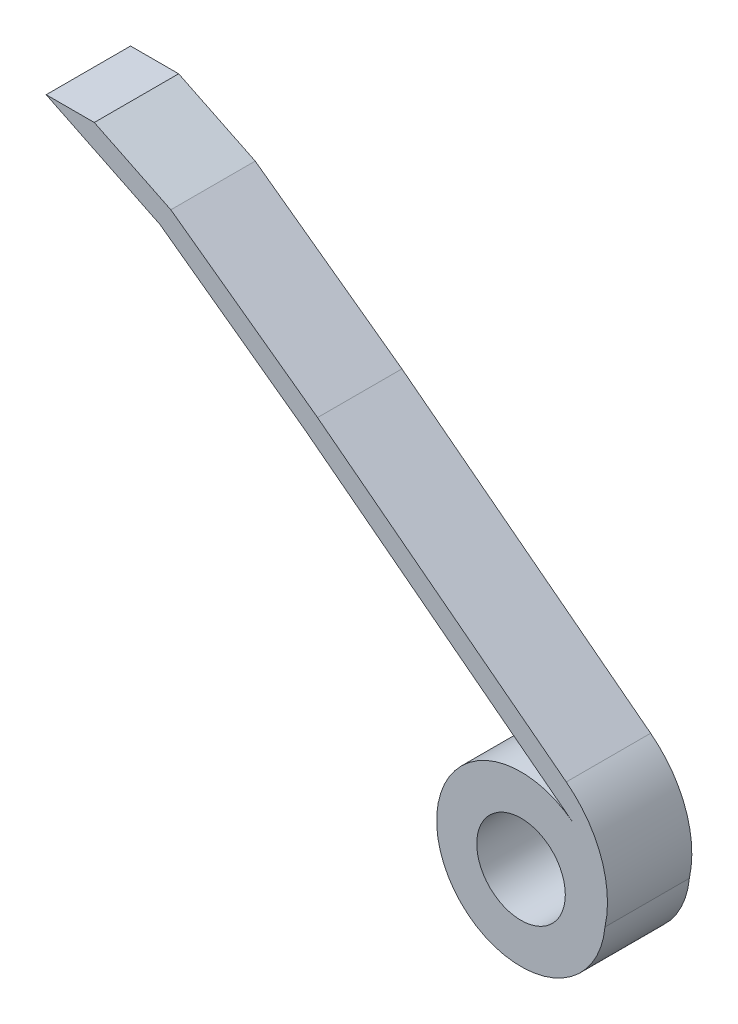
ISO-10303-21;
HEADER;
FILE_DESCRIPTION(('STEP AP214'),'2;1');
FILE_NAME('part.step','',(''),(''),'','','');
FILE_SCHEMA(('AUTOMOTIVE_DESIGN { 1 0 10303 214 1 1 1 1 }'));
ENDSEC;
DATA;
#1=APPLICATION_CONTEXT('core data for automotive mechanical design processes');
#2=APPLICATION_PROTOCOL_DEFINITION('international standard','automotive_design',2000,#1);
#3=PRODUCT_CONTEXT('',#1,'mechanical');
#4=PRODUCT('Part','Part','',(#3));
#5=PRODUCT_RELATED_PRODUCT_CATEGORY('part','',(#4));
#6=PRODUCT_DEFINITION_FORMATION('','',#4);
#7=PRODUCT_DEFINITION_CONTEXT('part definition',#1,'design');
#8=PRODUCT_DEFINITION('design','',#6,#7);
#9=PRODUCT_DEFINITION_SHAPE('','',#8);
#10=(LENGTH_UNIT() NAMED_UNIT(*) SI_UNIT(.MILLI.,.METRE.));
#11=(NAMED_UNIT(*) PLANE_ANGLE_UNIT() SI_UNIT($,.RADIAN.));
#12=(NAMED_UNIT(*) SI_UNIT($,.STERADIAN.) SOLID_ANGLE_UNIT());
#13=UNCERTAINTY_MEASURE_WITH_UNIT(LENGTH_MEASURE(1.E-05),#10,'distance_accuracy_value','');
#14=(GEOMETRIC_REPRESENTATION_CONTEXT(3) GLOBAL_UNCERTAINTY_ASSIGNED_CONTEXT((#13)) GLOBAL_UNIT_ASSIGNED_CONTEXT((#10,
#11,#12)) REPRESENTATION_CONTEXT('',''));
#15=CARTESIAN_POINT('',(0.,0.,0.));
#16=DIRECTION('',(0.,0.,1.));
#17=DIRECTION('',(1.,0.,0.));
#18=AXIS2_PLACEMENT_3D('',#15,#16,#17);
#19=CARTESIAN_POINT('',(0.,0.,4.));
#20=DIRECTION('',(0.,0.,-1.));
#21=DIRECTION('',(-1.,0.,0.));
#22=AXIS2_PLACEMENT_3D('',#19,#20,#21);
#23=CYLINDRICAL_SURFACE('',#22,4.);
#24=DIRECTION('',(0.,0.,1.));
#25=VECTOR('',#24,1.);
#26=CARTESIAN_POINT('',(3.98179641890232,-0.381178801111356,0.));
#27=LINE('',#26,#25);
#28=CARTESIAN_POINT('',(3.98179641890232,-0.381178801111356,0.));
#29=VERTEX_POINT('',#28);
#30=CARTESIAN_POINT('',(3.98179641890232,-0.381178801111356,4.));
#31=VERTEX_POINT('',#30);
#32=EDGE_CURVE('E149',#29,#31,#27,.T.);
#33=ORIENTED_EDGE('',*,*,#32,.T.);
#34=CARTESIAN_POINT('',(0.,0.,4.));
#35=DIRECTION('',(0.,0.,1.));
#36=DIRECTION('',(1.,0.,0.));
#37=AXIS2_PLACEMENT_3D('',#34,#35,#36);
#38=CIRCLE('',#37,4.);
#39=CARTESIAN_POINT('',(2.43775691262046,3.17133114558716,4.));
#40=VERTEX_POINT('',#39);
#41=EDGE_CURVE('E175',#40,#31,#38,.T.);
#42=ORIENTED_EDGE('',*,*,#41,.F.);
#43=DIRECTION('',(0.,0.,1.));
#44=VECTOR('',#43,1.);
#45=CARTESIAN_POINT('',(2.43775672639352,3.17133090332046,0.));
#46=LINE('',#45,#44);
#47=CARTESIAN_POINT('',(2.43775672639352,3.17133090332046,0.));
#48=VERTEX_POINT('',#47);
#49=EDGE_CURVE('E153',#48,#40,#46,.T.);
#50=ORIENTED_EDGE('',*,*,#49,.F.);
#51=CARTESIAN_POINT('',(0.,0.,0.));
#52=DIRECTION('',(0.,0.,1.));
#53=DIRECTION('',(1.,0.,0.));
#54=AXIS2_PLACEMENT_3D('',#51,#52,#53);
#55=CIRCLE('',#54,4.);
#56=EDGE_CURVE('E172',#48,#29,#55,.T.);
#57=ORIENTED_EDGE('',*,*,#56,.T.);
#58=EDGE_LOOP('',(#33,#42,#50,#57));
#59=FACE_BOUND('',#58,.T.);
#60=ADVANCED_FACE('F35',(#59),#23,.T.);
#61=CARTESIAN_POINT('',(0.,0.,4.));
#62=DIRECTION('',(0.,0.,1.));
#63=DIRECTION('',(1.,0.,0.));
#64=AXIS2_PLACEMENT_3D('',#61,#62,#63);
#65=PLANE('',#64);
#66=ORIENTED_EDGE('',*,*,#41,.T.);
#67=CARTESIAN_POINT('',(-0.901466799412946,0.69294425545584,4.));
#68=DIRECTION('',(0.,0.,1.));
#69=DIRECTION('',(1.,0.,0.));
#70=AXIS2_PLACEMENT_3D('',#67,#68,#69);
#71=CIRCLE('',#70,5.);
#72=CARTESIAN_POINT('',(2.14572934136264,4.65710818743979,4.));
#73=VERTEX_POINT('',#72);
#74=EDGE_CURVE('E57',#31,#73,#71,.T.);
#75=ORIENTED_EDGE('',*,*,#74,.T.);
#76=DIRECTION('',(0.792832786396789,-0.609439228155116,0.));
#77=VECTOR('',#76,1.);
#78=CARTESIAN_POINT('',(3.04719595454863,3.96416368971725,4.));
#79=LINE('',#78,#77);
#80=CARTESIAN_POINT('',(-9.64760231120973,13.7224736251955,4.));
#81=VERTEX_POINT('',#80);
#82=EDGE_CURVE('E139',#81,#73,#79,.T.);
#83=ORIENTED_EDGE('',*,*,#82,.F.);
#84=DIRECTION('',(0.809010602601369,-0.587794049713478,0.));
#85=VECTOR('',#84,1.);
#86=CARTESIAN_POINT('',(3.19220569377153,4.39359373100917,4.));
#87=LINE('',#86,#85);
#88=CARTESIAN_POINT('',(-16.604293056143,18.7769208875925,4.));
#89=VERTEX_POINT('',#88);
#90=EDGE_CURVE('E121',#89,#81,#87,.T.);
#91=ORIENTED_EDGE('',*,*,#90,.F.);
#92=DIRECTION('',(0.898789279287117,-0.438380920477323,0.));
#93=VECTOR('',#92,1.);
#94=CARTESIAN_POINT('',(4.20735646450855,8.62612104633155,4.));
#95=LINE('',#94,#93);
#96=CARTESIAN_POINT('',(-20.2329223511301,20.5467704920171,4.));
#97=VERTEX_POINT('',#96);
#98=EDGE_CURVE('E142',#97,#89,#95,.T.);
#99=ORIENTED_EDGE('',*,*,#98,.F.);
#100=DIRECTION('',(1.,0.,0.));
#101=VECTOR('',#100,1.);
#102=CARTESIAN_POINT('',(0.,20.5467704920171,4.));
#103=LINE('',#102,#101);
#104=CARTESIAN_POINT('',(-22.5140435251793,20.5467704920171,4.));
#105=VERTEX_POINT('',#104);
#106=EDGE_CURVE('E144',#105,#97,#103,.T.);
#107=ORIENTED_EDGE('',*,*,#106,.F.);
#108=DIRECTION('',(-0.898789279287117,0.438380920477323,0.));
#109=VECTOR('',#108,1.);
#110=CARTESIAN_POINT('',(3.76897554403123,7.72733176704442,4.));
#111=LINE('',#110,#109);
#112=CARTESIAN_POINT('',(-17.1213078494566,17.9164849691532,4.));
#113=VERTEX_POINT('',#112);
#114=EDGE_CURVE('E146',#113,#105,#111,.T.);
#115=ORIENTED_EDGE('',*,*,#114,.F.);
#116=DIRECTION('',(-0.809010602601368,0.587794049713478,0.));
#117=VECTOR('',#116,1.);
#118=CARTESIAN_POINT('',(2.60441164405805,3.58458312840779,4.));
#119=LINE('',#118,#117);
#120=CARTESIAN_POINT('',(-10.2463282528763,12.9214056886377,4.));
#121=VERTEX_POINT('',#120);
#122=EDGE_CURVE('E128',#121,#113,#119,.T.);
#123=ORIENTED_EDGE('',*,*,#122,.F.);
#124=DIRECTION('',(-0.792832786396789,0.609439228155116,0.));
#125=VECTOR('',#124,1.);
#126=CARTESIAN_POINT('',(2.43775672639352,3.17133090332046,4.));
#127=LINE('',#126,#125);
#128=EDGE_CURVE('E126',#40,#121,#127,.T.);
#129=ORIENTED_EDGE('',*,*,#128,.F.);
#130=EDGE_LOOP('',(#66,#75,#83,#91,#99,#107,#115,#123,#129));
#131=FACE_BOUND('',#130,.T.);
#132=CARTESIAN_POINT('',(0.,0.,4.));
#133=DIRECTION('',(0.,0.,1.));
#134=DIRECTION('',(1.,0.,0.));
#135=AXIS2_PLACEMENT_3D('',#132,#133,#134);
#136=CIRCLE('',#135,2.1);
#137=CARTESIAN_POINT('',(2.1,0.,4.));
#138=VERTEX_POINT('',#137);
#139=EDGE_CURVE('E169',#138,#138,#136,.T.);
#140=ORIENTED_EDGE('',*,*,#139,.F.);
#141=EDGE_LOOP('',(#140));
#142=FACE_BOUND('',#141,.T.);
#143=ADVANCED_FACE('F191',(#131,#142),#65,.T.);
#144=CARTESIAN_POINT('',(0.,0.,0.));
#145=DIRECTION('',(0.,0.,1.));
#146=DIRECTION('',(1.,0.,0.));
#147=AXIS2_PLACEMENT_3D('',#144,#145,#146);
#148=PLANE('',#147);
#149=DIRECTION('',(0.792832786396789,-0.609439228155116,0.));
#150=VECTOR('',#149,1.);
#151=CARTESIAN_POINT('',(3.04719595454863,3.96416368971725,0.));
#152=LINE('',#151,#150);
#153=CARTESIAN_POINT('',(-9.64760231120973,13.7224736251955,0.));
#154=VERTEX_POINT('',#153);
#155=CARTESIAN_POINT('',(2.14572934136263,4.65710818743979,0.));
#156=VERTEX_POINT('',#155);
#157=EDGE_CURVE('E109',#154,#156,#152,.T.);
#158=ORIENTED_EDGE('',*,*,#157,.T.);
#159=CARTESIAN_POINT('',(-0.901466799412946,0.69294425545584,0.));
#160=DIRECTION('',(0.,0.,1.));
#161=DIRECTION('',(1.,0.,0.));
#162=AXIS2_PLACEMENT_3D('',#159,#160,#161);
#163=CIRCLE('',#162,5.);
#164=EDGE_CURVE('E11',#156,#29,#163,.F.);
#165=ORIENTED_EDGE('',*,*,#164,.T.);
#166=ORIENTED_EDGE('',*,*,#56,.F.);
#167=DIRECTION('',(-0.792832786396789,0.609439228155116,0.));
#168=VECTOR('',#167,1.);
#169=CARTESIAN_POINT('',(2.43775672639352,3.17133090332046,0.));
#170=LINE('',#169,#168);
#171=CARTESIAN_POINT('',(-10.2463282528763,12.9214056886377,0.));
#172=VERTEX_POINT('',#171);
#173=EDGE_CURVE('E123',#48,#172,#170,.T.);
#174=ORIENTED_EDGE('',*,*,#173,.T.);
#175=DIRECTION('',(-0.809010602601368,0.587794049713478,0.));
#176=VECTOR('',#175,1.);
#177=CARTESIAN_POINT('',(2.60441164405805,3.58458312840779,0.));
#178=LINE('',#177,#176);
#179=CARTESIAN_POINT('',(-17.1213078494566,17.9164849691532,0.));
#180=VERTEX_POINT('',#179);
#181=EDGE_CURVE('E136',#172,#180,#178,.T.);
#182=ORIENTED_EDGE('',*,*,#181,.T.);
#183=DIRECTION('',(-0.898789279287117,0.438380920477323,0.));
#184=VECTOR('',#183,1.);
#185=CARTESIAN_POINT('',(3.76897554403123,7.72733176704442,0.));
#186=LINE('',#185,#184);
#187=CARTESIAN_POINT('',(-22.5140435251793,20.5467704920171,0.));
#188=VERTEX_POINT('',#187);
#189=EDGE_CURVE('E134',#180,#188,#186,.T.);
#190=ORIENTED_EDGE('',*,*,#189,.T.);
#191=DIRECTION('',(1.,0.,0.));
#192=VECTOR('',#191,1.);
#193=CARTESIAN_POINT('',(0.,20.5467704920171,0.));
#194=LINE('',#193,#192);
#195=CARTESIAN_POINT('',(-20.2329223511301,20.5467704920171,0.));
#196=VERTEX_POINT('',#195);
#197=EDGE_CURVE('E132',#188,#196,#194,.T.);
#198=ORIENTED_EDGE('',*,*,#197,.T.);
#199=DIRECTION('',(0.898789279287117,-0.438380920477323,0.));
#200=VECTOR('',#199,1.);
#201=CARTESIAN_POINT('',(4.20735646450855,8.62612104633155,0.));
#202=LINE('',#201,#200);
#203=CARTESIAN_POINT('',(-16.604293056143,18.7769208875925,0.));
#204=VERTEX_POINT('',#203);
#205=EDGE_CURVE('E112',#196,#204,#202,.T.);
#206=ORIENTED_EDGE('',*,*,#205,.T.);
#207=DIRECTION('',(0.809010602601369,-0.587794049713478,0.));
#208=VECTOR('',#207,1.);
#209=CARTESIAN_POINT('',(3.19220569377153,4.39359373100917,0.));
#210=LINE('',#209,#208);
#211=EDGE_CURVE('E105',#204,#154,#210,.T.);
#212=ORIENTED_EDGE('',*,*,#211,.T.);
#213=EDGE_LOOP('',(#158,#165,#166,#174,#182,#190,#198,#206,#212));
#214=FACE_BOUND('',#213,.T.);
#215=CARTESIAN_POINT('',(0.,0.,0.));
#216=DIRECTION('',(0.,0.,1.));
#217=DIRECTION('',(1.,0.,0.));
#218=AXIS2_PLACEMENT_3D('',#215,#216,#217);
#219=CIRCLE('',#218,2.1);
#220=CARTESIAN_POINT('',(2.1,0.,0.));
#221=VERTEX_POINT('',#220);
#222=EDGE_CURVE('E152',#221,#221,#219,.T.);
#223=ORIENTED_EDGE('',*,*,#222,.T.);
#224=EDGE_LOOP('',(#223));
#225=FACE_BOUND('',#224,.T.);
#226=ADVANCED_FACE('F107',(#214,#225),#148,.F.);
#227=CARTESIAN_POINT('',(0.,0.,4.));
#228=DIRECTION('',(0.,0.,-1.));
#229=DIRECTION('',(-1.,0.,0.));
#230=AXIS2_PLACEMENT_3D('',#227,#228,#229);
#231=CYLINDRICAL_SURFACE('',#230,2.1);
#232=ORIENTED_EDGE('',*,*,#139,.T.);
#233=EDGE_LOOP('',(#232));
#234=FACE_BOUND('',#233,.T.);
#235=ORIENTED_EDGE('',*,*,#222,.F.);
#236=EDGE_LOOP('',(#235));
#237=FACE_BOUND('',#236,.T.);
#238=ADVANCED_FACE('F198',(#234,#237),#231,.F.);
#239=CARTESIAN_POINT('',(2.43775672639352,3.17133090332046,0.));
#240=DIRECTION('',(0.609439228155116,0.792832786396789,0.));
#241=DIRECTION('',(-0.792832786396789,0.609439228155116,0.));
#242=AXIS2_PLACEMENT_3D('',#239,#240,#241);
#243=PLANE('',#242);
#244=ORIENTED_EDGE('',*,*,#128,.T.);
#245=DIRECTION('',(0.,0.,1.));
#246=VECTOR('',#245,1.);
#247=CARTESIAN_POINT('',(-10.2463282528763,12.9214056886377,0.));
#248=LINE('',#247,#246);
#249=EDGE_CURVE('E156',#172,#121,#248,.T.);
#250=ORIENTED_EDGE('',*,*,#249,.F.);
#251=ORIENTED_EDGE('',*,*,#173,.F.);
#252=ORIENTED_EDGE('',*,*,#49,.T.);
#253=EDGE_LOOP('',(#244,#250,#251,#252));
#254=FACE_BOUND('',#253,.T.);
#255=ADVANCED_FACE('F201',(#254),#243,.F.);
#256=CARTESIAN_POINT('',(2.60441164405805,3.58458312840779,0.));
#257=DIRECTION('',(0.587794049713478,0.809010602601368,0.));
#258=DIRECTION('',(-0.809010602601368,0.587794049713478,0.));
#259=AXIS2_PLACEMENT_3D('',#256,#257,#258);
#260=PLANE('',#259);
#261=ORIENTED_EDGE('',*,*,#122,.T.);
#262=DIRECTION('',(0.,0.,1.));
#263=VECTOR('',#262,1.);
#264=CARTESIAN_POINT('',(-17.1213078494566,17.9164849691532,0.));
#265=LINE('',#264,#263);
#266=EDGE_CURVE('E159',#180,#113,#265,.T.);
#267=ORIENTED_EDGE('',*,*,#266,.F.);
#268=ORIENTED_EDGE('',*,*,#181,.F.);
#269=ORIENTED_EDGE('',*,*,#249,.T.);
#270=EDGE_LOOP('',(#261,#267,#268,#269));
#271=FACE_BOUND('',#270,.T.);
#272=ADVANCED_FACE('F217',(#271),#260,.F.);
#273=CARTESIAN_POINT('',(3.76897554403123,7.72733176704442,0.));
#274=DIRECTION('',(0.438380920477323,0.898789279287117,0.));
#275=DIRECTION('',(-0.898789279287117,0.438380920477323,0.));
#276=AXIS2_PLACEMENT_3D('',#273,#274,#275);
#277=PLANE('',#276);
#278=ORIENTED_EDGE('',*,*,#114,.T.);
#279=DIRECTION('',(0.,0.,1.));
#280=VECTOR('',#279,1.);
#281=CARTESIAN_POINT('',(-22.5140435251793,20.5467704920171,0.));
#282=LINE('',#281,#280);
#283=EDGE_CURVE('E162',#188,#105,#282,.T.);
#284=ORIENTED_EDGE('',*,*,#283,.F.);
#285=ORIENTED_EDGE('',*,*,#189,.F.);
#286=ORIENTED_EDGE('',*,*,#266,.T.);
#287=EDGE_LOOP('',(#278,#284,#285,#286));
#288=FACE_BOUND('',#287,.T.);
#289=ADVANCED_FACE('F213',(#288),#277,.F.);
#290=CARTESIAN_POINT('',(0.,20.5467704920171,0.));
#291=DIRECTION('',(0.,-1.,0.));
#292=DIRECTION('',(0.,0.,-1.));
#293=AXIS2_PLACEMENT_3D('',#290,#291,#292);
#294=PLANE('',#293);
#295=ORIENTED_EDGE('',*,*,#106,.T.);
#296=DIRECTION('',(0.,0.,1.));
#297=VECTOR('',#296,1.);
#298=CARTESIAN_POINT('',(-20.2329223511301,20.5467704920171,0.));
#299=LINE('',#298,#297);
#300=EDGE_CURVE('E165',#196,#97,#299,.T.);
#301=ORIENTED_EDGE('',*,*,#300,.F.);
#302=ORIENTED_EDGE('',*,*,#197,.F.);
#303=ORIENTED_EDGE('',*,*,#283,.T.);
#304=EDGE_LOOP('',(#295,#301,#302,#303));
#305=FACE_BOUND('',#304,.T.);
#306=ADVANCED_FACE('F209',(#305),#294,.F.);
#307=CARTESIAN_POINT('',(4.20735646450855,8.62612104633155,0.));
#308=DIRECTION('',(-0.438380920477323,-0.898789279287117,0.));
#309=DIRECTION('',(0.898789279287117,-0.438380920477323,0.));
#310=AXIS2_PLACEMENT_3D('',#307,#308,#309);
#311=PLANE('',#310);
#312=ORIENTED_EDGE('',*,*,#98,.T.);
#313=DIRECTION('',(0.,0.,1.));
#314=VECTOR('',#313,1.);
#315=CARTESIAN_POINT('',(-16.604293056143,18.7769208875925,0.));
#316=LINE('',#315,#314);
#317=EDGE_CURVE('E122',#204,#89,#316,.T.);
#318=ORIENTED_EDGE('',*,*,#317,.F.);
#319=ORIENTED_EDGE('',*,*,#205,.F.);
#320=ORIENTED_EDGE('',*,*,#300,.T.);
#321=EDGE_LOOP('',(#312,#318,#319,#320));
#322=FACE_BOUND('',#321,.T.);
#323=ADVANCED_FACE('F206',(#322),#311,.F.);
#324=CARTESIAN_POINT('',(3.19220569377153,4.39359373100917,0.));
#325=DIRECTION('',(-0.587794049713478,-0.809010602601369,0.));
#326=DIRECTION('',(0.809010602601369,-0.587794049713478,0.));
#327=AXIS2_PLACEMENT_3D('',#324,#325,#326);
#328=PLANE('',#327);
#329=ORIENTED_EDGE('',*,*,#90,.T.);
#330=DIRECTION('',(0.,0.,1.));
#331=VECTOR('',#330,1.);
#332=CARTESIAN_POINT('',(-9.64760231120973,13.7224736251955,0.));
#333=LINE('',#332,#331);
#334=EDGE_CURVE('E118',#154,#81,#333,.T.);
#335=ORIENTED_EDGE('',*,*,#334,.F.);
#336=ORIENTED_EDGE('',*,*,#211,.F.);
#337=ORIENTED_EDGE('',*,*,#317,.T.);
#338=EDGE_LOOP('',(#329,#335,#336,#337));
#339=FACE_BOUND('',#338,.T.);
#340=ADVANCED_FACE('F119',(#339),#328,.F.);
#341=CARTESIAN_POINT('',(3.04719595454863,3.96416368971725,0.));
#342=DIRECTION('',(-0.609439228155116,-0.792832786396789,0.));
#343=DIRECTION('',(0.792832786396789,-0.609439228155116,0.));
#344=AXIS2_PLACEMENT_3D('',#341,#342,#343);
#345=PLANE('',#344);
#346=ORIENTED_EDGE('',*,*,#82,.T.);
#347=DIRECTION('',(0.,0.,-1.));
#348=VECTOR('',#347,1.);
#349=CARTESIAN_POINT('',(2.14572934136264,4.65710818743979,0.));
#350=LINE('',#349,#348);
#351=EDGE_CURVE('E43',#73,#156,#350,.T.);
#352=ORIENTED_EDGE('',*,*,#351,.T.);
#353=ORIENTED_EDGE('',*,*,#157,.F.);
#354=ORIENTED_EDGE('',*,*,#334,.T.);
#355=EDGE_LOOP('',(#346,#352,#353,#354));
#356=FACE_BOUND('',#355,.T.);
#357=ADVANCED_FACE('F125',(#356),#345,.F.);
#358=CARTESIAN_POINT('',(-0.901466799412946,0.69294425545584,4.));
#359=DIRECTION('',(0.,0.,-1.));
#360=DIRECTION('',(-1.,0.,0.));
#361=AXIS2_PLACEMENT_3D('',#358,#359,#360);
#362=CYLINDRICAL_SURFACE('',#361,5.);
#363=ORIENTED_EDGE('',*,*,#164,.F.);
#364=ORIENTED_EDGE('',*,*,#351,.F.);
#365=ORIENTED_EDGE('',*,*,#74,.F.);
#366=ORIENTED_EDGE('',*,*,#32,.F.);
#367=EDGE_LOOP('',(#363,#364,#365,#366));
#368=FACE_BOUND('',#367,.T.);
#369=ADVANCED_FACE('F37',(#368),#362,.T.);
#370=CLOSED_SHELL('',(#60,#143,#226,#238,#255,#272,#289,#306,#323,#340,#357,#369));
#371=MANIFOLD_SOLID_BREP('B2',#370);
#372=ADVANCED_BREP_SHAPE_REPRESENTATION('',(#18,#371),#14);
#373=SHAPE_DEFINITION_REPRESENTATION(#9,#372);
ENDSEC;
END-ISO-10303-21;
